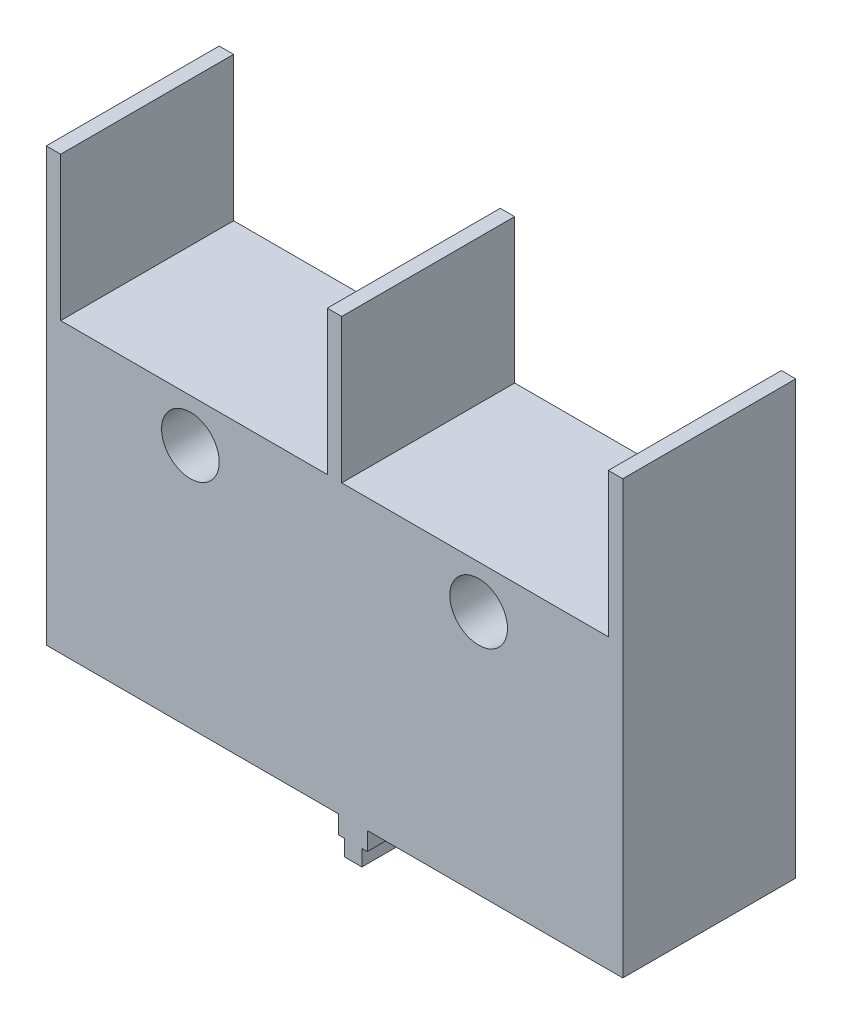
ISO-10303-21;
HEADER;
FILE_DESCRIPTION(('STEP AP214'),'2;1');
FILE_NAME('part.step','',(''),(''),'','','');
FILE_SCHEMA(('AUTOMOTIVE_DESIGN { 1 0 10303 214 1 1 1 1 }'));
ENDSEC;
DATA;
#1=APPLICATION_CONTEXT('core data for automotive mechanical design processes');
#2=APPLICATION_PROTOCOL_DEFINITION('international standard','automotive_design',2000,#1);
#3=PRODUCT_CONTEXT('',#1,'mechanical');
#4=PRODUCT('Part','Part','',(#3));
#5=PRODUCT_RELATED_PRODUCT_CATEGORY('part','',(#4));
#6=PRODUCT_DEFINITION_FORMATION('','',#4);
#7=PRODUCT_DEFINITION_CONTEXT('part definition',#1,'design');
#8=PRODUCT_DEFINITION('design','',#6,#7);
#9=PRODUCT_DEFINITION_SHAPE('','',#8);
#10=(LENGTH_UNIT() NAMED_UNIT(*) SI_UNIT(.MILLI.,.METRE.));
#11=(NAMED_UNIT(*) PLANE_ANGLE_UNIT() SI_UNIT($,.RADIAN.));
#12=(NAMED_UNIT(*) SI_UNIT($,.STERADIAN.) SOLID_ANGLE_UNIT());
#13=UNCERTAINTY_MEASURE_WITH_UNIT(LENGTH_MEASURE(1.E-05),#10,'distance_accuracy_value','');
#14=(GEOMETRIC_REPRESENTATION_CONTEXT(3) GLOBAL_UNCERTAINTY_ASSIGNED_CONTEXT((#13)) GLOBAL_UNIT_ASSIGNED_CONTEXT((#10,
#11,#12)) REPRESENTATION_CONTEXT('',''));
#15=CARTESIAN_POINT('',(0.,0.,0.));
#16=DIRECTION('',(0.,0.,1.));
#17=DIRECTION('',(1.,0.,0.));
#18=AXIS2_PLACEMENT_3D('',#15,#16,#17);
#19=CARTESIAN_POINT('',(0.,0.,6.));
#20=DIRECTION('',(0.,0.,-1.));
#21=DIRECTION('',(-1.,0.,0.));
#22=AXIS2_PLACEMENT_3D('',#19,#20,#21);
#23=PLANE('',#22);
#24=CARTESIAN_POINT('',(5.,8.5,6.));
#25=DIRECTION('',(0.,0.,1.));
#26=DIRECTION('',(1.,0.,0.));
#27=AXIS2_PLACEMENT_3D('',#24,#25,#26);
#28=CIRCLE('',#27,0.999999999999999);
#29=CARTESIAN_POINT('',(6.,8.5,6.));
#30=VERTEX_POINT('',#29);
#31=EDGE_CURVE('E208',#30,#30,#28,.T.);
#32=ORIENTED_EDGE('',*,*,#31,.F.);
#33=EDGE_LOOP('',(#32));
#34=FACE_BOUND('',#33,.T.);
#35=DIRECTION('',(0.,-1.,0.));
#36=VECTOR('',#35,1.);
#37=CARTESIAN_POINT('',(0.,0.,6.));
#38=LINE('',#37,#36);
#39=CARTESIAN_POINT('',(0.,15.,6.));
#40=VERTEX_POINT('',#39);
#41=CARTESIAN_POINT('',(0.,0.,6.));
#42=VERTEX_POINT('',#41);
#43=EDGE_CURVE('E49',#40,#42,#38,.T.);
#44=ORIENTED_EDGE('',*,*,#43,.T.);
#45=DIRECTION('',(1.,0.,0.));
#46=VECTOR('',#45,1.);
#47=CARTESIAN_POINT('',(0.,0.,6.));
#48=LINE('',#47,#46);
#49=CARTESIAN_POINT('',(10.1399803490076,0.,6.));
#50=VERTEX_POINT('',#49);
#51=EDGE_CURVE('E129',#42,#50,#48,.T.);
#52=ORIENTED_EDGE('',*,*,#51,.T.);
#53=DIRECTION('',(0.,-1.,0.));
#54=VECTOR('',#53,1.);
#55=CARTESIAN_POINT('',(10.1399803490076,0.,6.));
#56=LINE('',#55,#54);
#57=CARTESIAN_POINT('',(10.1399803490076,-0.631853680772032,6.));
#58=VERTEX_POINT('',#57);
#59=EDGE_CURVE('E294',#50,#58,#56,.T.);
#60=ORIENTED_EDGE('',*,*,#59,.T.);
#61=DIRECTION('',(1.,0.,0.));
#62=VECTOR('',#61,1.);
#63=CARTESIAN_POINT('',(10.1399803490076,-0.631853680772032,6.));
#64=LINE('',#63,#62);
#65=CARTESIAN_POINT('',(10.3501286029433,-0.631853680772032,6.));
#66=VERTEX_POINT('',#65);
#67=EDGE_CURVE('E314',#58,#66,#64,.T.);
#68=ORIENTED_EDGE('',*,*,#67,.T.);
#69=DIRECTION('',(0.,-1.,0.));
#70=VECTOR('',#69,1.);
#71=CARTESIAN_POINT('',(10.3501286029433,-0.631853680772032,6.));
#72=LINE('',#71,#70);
#73=CARTESIAN_POINT('',(10.3501286029433,-1.19034003065284,6.));
#74=VERTEX_POINT('',#73);
#75=EDGE_CURVE('E311',#66,#74,#72,.T.);
#76=ORIENTED_EDGE('',*,*,#75,.T.);
#77=DIRECTION('',(1.,0.,0.));
#78=VECTOR('',#77,1.);
#79=CARTESIAN_POINT('',(10.3501286029433,-1.19034003065284,6.));
#80=LINE('',#79,#78);
#81=CARTESIAN_POINT('',(10.9501286029433,-1.19034003065284,6.));
#82=VERTEX_POINT('',#81);
#83=EDGE_CURVE('E313',#74,#82,#80,.T.);
#84=ORIENTED_EDGE('',*,*,#83,.T.);
#85=DIRECTION('',(0.,1.,0.));
#86=VECTOR('',#85,1.);
#87=CARTESIAN_POINT('',(10.9501286029433,-1.19034003065284,6.));
#88=LINE('',#87,#86);
#89=CARTESIAN_POINT('',(10.9501286029433,-0.631853680772032,6.));
#90=VERTEX_POINT('',#89);
#91=EDGE_CURVE('E316',#82,#90,#88,.T.);
#92=ORIENTED_EDGE('',*,*,#91,.T.);
#93=DIRECTION('',(1.,0.,0.));
#94=VECTOR('',#93,1.);
#95=CARTESIAN_POINT('',(10.9501286029433,-0.631853680772032,6.));
#96=LINE('',#95,#94);
#97=CARTESIAN_POINT('',(11.13640568414,-0.631853680772032,6.));
#98=VERTEX_POINT('',#97);
#99=EDGE_CURVE('E322',#90,#98,#96,.T.);
#100=ORIENTED_EDGE('',*,*,#99,.T.);
#101=DIRECTION('',(0.,1.,0.));
#102=VECTOR('',#101,1.);
#103=CARTESIAN_POINT('',(11.13640568414,-0.631853680772032,6.));
#104=LINE('',#103,#102);
#105=CARTESIAN_POINT('',(11.13640568414,0.,6.));
#106=VERTEX_POINT('',#105);
#107=EDGE_CURVE('E324',#98,#106,#104,.T.);
#108=ORIENTED_EDGE('',*,*,#107,.T.);
#109=DIRECTION('',(1.,0.,0.));
#110=VECTOR('',#109,1.);
#111=CARTESIAN_POINT('',(11.13640568414,0.,6.));
#112=LINE('',#111,#110);
#113=CARTESIAN_POINT('',(20.,0.,6.));
#114=VERTEX_POINT('',#113);
#115=EDGE_CURVE('E326',#106,#114,#112,.T.);
#116=ORIENTED_EDGE('',*,*,#115,.T.);
#117=DIRECTION('',(0.,1.,0.));
#118=VECTOR('',#117,1.);
#119=CARTESIAN_POINT('',(20.,0.,6.));
#120=LINE('',#119,#118);
#121=CARTESIAN_POINT('',(20.,15.,6.));
#122=VERTEX_POINT('',#121);
#123=EDGE_CURVE('E328',#114,#122,#120,.T.);
#124=ORIENTED_EDGE('',*,*,#123,.T.);
#125=DIRECTION('',(-1.,0.,0.));
#126=VECTOR('',#125,1.);
#127=CARTESIAN_POINT('',(20.,15.,6.));
#128=LINE('',#127,#126);
#129=CARTESIAN_POINT('',(19.5,15.,6.));
#130=VERTEX_POINT('',#129);
#131=EDGE_CURVE('E330',#122,#130,#128,.T.);
#132=ORIENTED_EDGE('',*,*,#131,.T.);
#133=DIRECTION('',(0.,-1.,0.));
#134=VECTOR('',#133,1.);
#135=CARTESIAN_POINT('',(19.5,10.,6.));
#136=LINE('',#135,#134);
#137=CARTESIAN_POINT('',(19.5,10.,6.));
#138=VERTEX_POINT('',#137);
#139=EDGE_CURVE('E332',#130,#138,#136,.T.);
#140=ORIENTED_EDGE('',*,*,#139,.T.);
#141=DIRECTION('',(-1.,0.,0.));
#142=VECTOR('',#141,1.);
#143=CARTESIAN_POINT('',(10.25,10.,6.));
#144=LINE('',#143,#142);
#145=CARTESIAN_POINT('',(10.25,10.,6.));
#146=VERTEX_POINT('',#145);
#147=EDGE_CURVE('E334',#138,#146,#144,.T.);
#148=ORIENTED_EDGE('',*,*,#147,.T.);
#149=DIRECTION('',(0.,1.,0.));
#150=VECTOR('',#149,1.);
#151=CARTESIAN_POINT('',(10.25,10.,6.));
#152=LINE('',#151,#150);
#153=CARTESIAN_POINT('',(10.25,15.,6.));
#154=VERTEX_POINT('',#153);
#155=EDGE_CURVE('E336',#146,#154,#152,.T.);
#156=ORIENTED_EDGE('',*,*,#155,.T.);
#157=DIRECTION('',(-1.,0.,0.));
#158=VECTOR('',#157,1.);
#159=CARTESIAN_POINT('',(10.25,15.,6.));
#160=LINE('',#159,#158);
#161=CARTESIAN_POINT('',(9.75,15.,6.));
#162=VERTEX_POINT('',#161);
#163=EDGE_CURVE('E338',#154,#162,#160,.T.);
#164=ORIENTED_EDGE('',*,*,#163,.T.);
#165=DIRECTION('',(0.,-1.,0.));
#166=VECTOR('',#165,1.);
#167=CARTESIAN_POINT('',(9.75,10.,6.));
#168=LINE('',#167,#166);
#169=CARTESIAN_POINT('',(9.75,10.,6.));
#170=VERTEX_POINT('',#169);
#171=EDGE_CURVE('E185',#162,#170,#168,.T.);
#172=ORIENTED_EDGE('',*,*,#171,.T.);
#173=DIRECTION('',(-1.,0.,0.));
#174=VECTOR('',#173,1.);
#175=CARTESIAN_POINT('',(0.5,10.,6.));
#176=LINE('',#175,#174);
#177=CARTESIAN_POINT('',(0.5,10.,6.));
#178=VERTEX_POINT('',#177);
#179=EDGE_CURVE('E179',#170,#178,#176,.T.);
#180=ORIENTED_EDGE('',*,*,#179,.T.);
#181=DIRECTION('',(0.,1.,0.));
#182=VECTOR('',#181,1.);
#183=CARTESIAN_POINT('',(0.5,10.,6.));
#184=LINE('',#183,#182);
#185=CARTESIAN_POINT('',(0.5,15.,6.));
#186=VERTEX_POINT('',#185);
#187=EDGE_CURVE('E183',#178,#186,#184,.T.);
#188=ORIENTED_EDGE('',*,*,#187,.T.);
#189=DIRECTION('',(-1.,0.,0.));
#190=VECTOR('',#189,1.);
#191=CARTESIAN_POINT('',(0.,15.,6.));
#192=LINE('',#191,#190);
#193=EDGE_CURVE('E199',#186,#40,#192,.T.);
#194=ORIENTED_EDGE('',*,*,#193,.T.);
#195=EDGE_LOOP('',(#44,#52,#60,#68,#76,#84,#92,#100,#108,#116,#124,#132,#140,#148,#156,#164,
#172,#180,#188,#194));
#196=FACE_BOUND('',#195,.T.);
#197=CARTESIAN_POINT('',(15.,8.5,6.));
#198=DIRECTION('',(0.,0.,1.));
#199=DIRECTION('',(1.,0.,0.));
#200=AXIS2_PLACEMENT_3D('',#197,#198,#199);
#201=CIRCLE('',#200,1.);
#202=CARTESIAN_POINT('',(16.,8.5,6.));
#203=VERTEX_POINT('',#202);
#204=EDGE_CURVE('E357',#203,#203,#201,.T.);
#205=ORIENTED_EDGE('',*,*,#204,.F.);
#206=EDGE_LOOP('',(#205));
#207=FACE_BOUND('',#206,.T.);
#208=ADVANCED_FACE('F32',(#34,#196,#207),#23,.F.);
#209=CARTESIAN_POINT('',(0.,0.,0.));
#210=DIRECTION('',(0.,0.,-1.));
#211=DIRECTION('',(-1.,0.,0.));
#212=AXIS2_PLACEMENT_3D('',#209,#210,#211);
#213=PLANE('',#212);
#214=CARTESIAN_POINT('',(5.,8.5,0.));
#215=DIRECTION('',(0.,0.,1.));
#216=DIRECTION('',(1.,0.,0.));
#217=AXIS2_PLACEMENT_3D('',#214,#215,#216);
#218=CIRCLE('',#217,0.999999999999999);
#219=CARTESIAN_POINT('',(6.,8.5,0.));
#220=VERTEX_POINT('',#219);
#221=EDGE_CURVE('E354',#220,#220,#218,.T.);
#222=ORIENTED_EDGE('',*,*,#221,.T.);
#223=EDGE_LOOP('',(#222));
#224=FACE_BOUND('',#223,.T.);
#225=DIRECTION('',(1.,0.,0.));
#226=VECTOR('',#225,1.);
#227=CARTESIAN_POINT('',(0.,0.,0.));
#228=LINE('',#227,#226);
#229=CARTESIAN_POINT('',(0.,0.,0.));
#230=VERTEX_POINT('',#229);
#231=CARTESIAN_POINT('',(10.1399803490076,0.,0.));
#232=VERTEX_POINT('',#231);
#233=EDGE_CURVE('E205',#230,#232,#228,.T.);
#234=ORIENTED_EDGE('',*,*,#233,.F.);
#235=DIRECTION('',(0.,-1.,0.));
#236=VECTOR('',#235,1.);
#237=CARTESIAN_POINT('',(0.,10.,0.));
#238=LINE('',#237,#236);
#239=CARTESIAN_POINT('',(0.,15.,0.));
#240=VERTEX_POINT('',#239);
#241=EDGE_CURVE('E242',#240,#230,#238,.T.);
#242=ORIENTED_EDGE('',*,*,#241,.F.);
#243=DIRECTION('',(-1.,0.,0.));
#244=VECTOR('',#243,1.);
#245=CARTESIAN_POINT('',(0.,15.,0.));
#246=LINE('',#245,#244);
#247=CARTESIAN_POINT('',(0.5,15.,0.));
#248=VERTEX_POINT('',#247);
#249=EDGE_CURVE('E122',#248,#240,#246,.T.);
#250=ORIENTED_EDGE('',*,*,#249,.F.);
#251=DIRECTION('',(0.,1.,0.));
#252=VECTOR('',#251,1.);
#253=CARTESIAN_POINT('',(0.5,10.,0.));
#254=LINE('',#253,#252);
#255=CARTESIAN_POINT('',(0.5,10.,0.));
#256=VERTEX_POINT('',#255);
#257=EDGE_CURVE('E115',#256,#248,#254,.T.);
#258=ORIENTED_EDGE('',*,*,#257,.F.);
#259=DIRECTION('',(-1.,0.,0.));
#260=VECTOR('',#259,1.);
#261=CARTESIAN_POINT('',(0.5,10.,0.));
#262=LINE('',#261,#260);
#263=CARTESIAN_POINT('',(9.75,10.,0.));
#264=VERTEX_POINT('',#263);
#265=EDGE_CURVE('E193',#264,#256,#262,.T.);
#266=ORIENTED_EDGE('',*,*,#265,.F.);
#267=DIRECTION('',(0.,-1.,0.));
#268=VECTOR('',#267,1.);
#269=CARTESIAN_POINT('',(9.75,10.,0.));
#270=LINE('',#269,#268);
#271=CARTESIAN_POINT('',(9.75,15.,0.));
#272=VERTEX_POINT('',#271);
#273=EDGE_CURVE('E237',#272,#264,#270,.T.);
#274=ORIENTED_EDGE('',*,*,#273,.F.);
#275=DIRECTION('',(-1.,0.,0.));
#276=VECTOR('',#275,1.);
#277=CARTESIAN_POINT('',(10.25,15.,0.));
#278=LINE('',#277,#276);
#279=CARTESIAN_POINT('',(10.25,15.,0.));
#280=VERTEX_POINT('',#279);
#281=EDGE_CURVE('E235',#280,#272,#278,.T.);
#282=ORIENTED_EDGE('',*,*,#281,.F.);
#283=DIRECTION('',(0.,1.,0.));
#284=VECTOR('',#283,1.);
#285=CARTESIAN_POINT('',(10.25,10.,0.));
#286=LINE('',#285,#284);
#287=CARTESIAN_POINT('',(10.25,10.,0.));
#288=VERTEX_POINT('',#287);
#289=EDGE_CURVE('E233',#288,#280,#286,.T.);
#290=ORIENTED_EDGE('',*,*,#289,.F.);
#291=DIRECTION('',(-1.,0.,0.));
#292=VECTOR('',#291,1.);
#293=CARTESIAN_POINT('',(10.25,10.,0.));
#294=LINE('',#293,#292);
#295=CARTESIAN_POINT('',(19.5,10.,0.));
#296=VERTEX_POINT('',#295);
#297=EDGE_CURVE('E231',#296,#288,#294,.T.);
#298=ORIENTED_EDGE('',*,*,#297,.F.);
#299=DIRECTION('',(0.,-1.,0.));
#300=VECTOR('',#299,1.);
#301=CARTESIAN_POINT('',(19.5,10.,0.));
#302=LINE('',#301,#300);
#303=CARTESIAN_POINT('',(19.5,15.,0.));
#304=VERTEX_POINT('',#303);
#305=EDGE_CURVE('E229',#304,#296,#302,.T.);
#306=ORIENTED_EDGE('',*,*,#305,.F.);
#307=DIRECTION('',(-1.,0.,0.));
#308=VECTOR('',#307,1.);
#309=CARTESIAN_POINT('',(20.,15.,0.));
#310=LINE('',#309,#308);
#311=CARTESIAN_POINT('',(20.,15.,0.));
#312=VERTEX_POINT('',#311);
#313=EDGE_CURVE('E227',#312,#304,#310,.T.);
#314=ORIENTED_EDGE('',*,*,#313,.F.);
#315=DIRECTION('',(0.,1.,0.));
#316=VECTOR('',#315,1.);
#317=CARTESIAN_POINT('',(20.,10.,0.));
#318=LINE('',#317,#316);
#319=CARTESIAN_POINT('',(20.,0.,0.));
#320=VERTEX_POINT('',#319);
#321=EDGE_CURVE('E225',#320,#312,#318,.T.);
#322=ORIENTED_EDGE('',*,*,#321,.F.);
#323=DIRECTION('',(1.,0.,0.));
#324=VECTOR('',#323,1.);
#325=CARTESIAN_POINT('',(11.13640568414,0.,0.));
#326=LINE('',#325,#324);
#327=CARTESIAN_POINT('',(11.13640568414,0.,0.));
#328=VERTEX_POINT('',#327);
#329=EDGE_CURVE('E222',#328,#320,#326,.T.);
#330=ORIENTED_EDGE('',*,*,#329,.F.);
#331=DIRECTION('',(0.,1.,0.));
#332=VECTOR('',#331,1.);
#333=CARTESIAN_POINT('',(11.13640568414,-0.631853680772032,0.));
#334=LINE('',#333,#332);
#335=CARTESIAN_POINT('',(11.13640568414,-0.631853680772032,0.));
#336=VERTEX_POINT('',#335);
#337=EDGE_CURVE('E220',#336,#328,#334,.T.);
#338=ORIENTED_EDGE('',*,*,#337,.F.);
#339=DIRECTION('',(1.,0.,0.));
#340=VECTOR('',#339,1.);
#341=CARTESIAN_POINT('',(10.9501286029433,-0.631853680772032,0.));
#342=LINE('',#341,#340);
#343=CARTESIAN_POINT('',(10.9501286029433,-0.631853680772032,0.));
#344=VERTEX_POINT('',#343);
#345=EDGE_CURVE('E218',#344,#336,#342,.T.);
#346=ORIENTED_EDGE('',*,*,#345,.F.);
#347=DIRECTION('',(0.,1.,0.));
#348=VECTOR('',#347,1.);
#349=CARTESIAN_POINT('',(10.9501286029433,-1.19034003065284,0.));
#350=LINE('',#349,#348);
#351=CARTESIAN_POINT('',(10.9501286029433,-1.19034003065284,0.));
#352=VERTEX_POINT('',#351);
#353=EDGE_CURVE('E216',#352,#344,#350,.T.);
#354=ORIENTED_EDGE('',*,*,#353,.F.);
#355=DIRECTION('',(1.,0.,0.));
#356=VECTOR('',#355,1.);
#357=CARTESIAN_POINT('',(10.3501286029433,-1.19034003065284,0.));
#358=LINE('',#357,#356);
#359=CARTESIAN_POINT('',(10.3501286029433,-1.19034003065284,0.));
#360=VERTEX_POINT('',#359);
#361=EDGE_CURVE('E214',#360,#352,#358,.T.);
#362=ORIENTED_EDGE('',*,*,#361,.F.);
#363=DIRECTION('',(0.,-1.,0.));
#364=VECTOR('',#363,1.);
#365=CARTESIAN_POINT('',(10.3501286029433,-0.631853680772032,0.));
#366=LINE('',#365,#364);
#367=CARTESIAN_POINT('',(10.3501286029433,-0.631853680772032,0.));
#368=VERTEX_POINT('',#367);
#369=EDGE_CURVE('E212',#368,#360,#366,.T.);
#370=ORIENTED_EDGE('',*,*,#369,.F.);
#371=DIRECTION('',(1.,0.,0.));
#372=VECTOR('',#371,1.);
#373=CARTESIAN_POINT('',(10.1399803490076,-0.631853680772032,0.));
#374=LINE('',#373,#372);
#375=CARTESIAN_POINT('',(10.1399803490076,-0.631853680772032,0.));
#376=VERTEX_POINT('',#375);
#377=EDGE_CURVE('E210',#376,#368,#374,.T.);
#378=ORIENTED_EDGE('',*,*,#377,.F.);
#379=DIRECTION('',(0.,-1.,0.));
#380=VECTOR('',#379,1.);
#381=CARTESIAN_POINT('',(10.1399803490076,0.,0.));
#382=LINE('',#381,#380);
#383=EDGE_CURVE('E207',#232,#376,#382,.T.);
#384=ORIENTED_EDGE('',*,*,#383,.F.);
#385=EDGE_LOOP('',(#234,#242,#250,#258,#266,#274,#282,#290,#298,#306,#314,#322,#330,#338,#346,
#354,#362,#370,#378,#384));
#386=FACE_BOUND('',#385,.T.);
#387=CARTESIAN_POINT('',(15.,8.5,0.));
#388=DIRECTION('',(0.,0.,1.));
#389=DIRECTION('',(1.,0.,0.));
#390=AXIS2_PLACEMENT_3D('',#387,#388,#389);
#391=CIRCLE('',#390,1.);
#392=CARTESIAN_POINT('',(16.,8.5,0.));
#393=VERTEX_POINT('',#392);
#394=EDGE_CURVE('E360',#393,#393,#391,.T.);
#395=ORIENTED_EDGE('',*,*,#394,.T.);
#396=EDGE_LOOP('',(#395));
#397=FACE_BOUND('',#396,.T.);
#398=ADVANCED_FACE('F298',(#224,#386,#397),#213,.T.);
#399=CARTESIAN_POINT('',(0.,0.,6.));
#400=DIRECTION('',(0.,1.,0.));
#401=DIRECTION('',(0.,0.,1.));
#402=AXIS2_PLACEMENT_3D('',#399,#400,#401);
#403=PLANE('',#402);
#404=ORIENTED_EDGE('',*,*,#233,.T.);
#405=DIRECTION('',(0.,0.,-1.));
#406=VECTOR('',#405,1.);
#407=CARTESIAN_POINT('',(10.1399803490076,0.,6.));
#408=LINE('',#407,#406);
#409=EDGE_CURVE('E41',#50,#232,#408,.T.);
#410=ORIENTED_EDGE('',*,*,#409,.F.);
#411=ORIENTED_EDGE('',*,*,#51,.F.);
#412=DIRECTION('',(0.,0.,-1.));
#413=VECTOR('',#412,1.);
#414=CARTESIAN_POINT('',(0.,0.,6.));
#415=LINE('',#414,#413);
#416=EDGE_CURVE('E11',#42,#230,#415,.T.);
#417=ORIENTED_EDGE('',*,*,#416,.T.);
#418=EDGE_LOOP('',(#404,#410,#411,#417));
#419=FACE_BOUND('',#418,.T.);
#420=ADVANCED_FACE('F34',(#419),#403,.F.);
#421=CARTESIAN_POINT('',(10.1399803490076,0.,6.));
#422=DIRECTION('',(1.,0.,0.));
#423=DIRECTION('',(0.,0.,-1.));
#424=AXIS2_PLACEMENT_3D('',#421,#422,#423);
#425=PLANE('',#424);
#426=ORIENTED_EDGE('',*,*,#383,.T.);
#427=DIRECTION('',(0.,0.,-1.));
#428=VECTOR('',#427,1.);
#429=CARTESIAN_POINT('',(10.1399803490076,-0.631853680772032,6.));
#430=LINE('',#429,#428);
#431=EDGE_CURVE('E286',#58,#376,#430,.T.);
#432=ORIENTED_EDGE('',*,*,#431,.F.);
#433=ORIENTED_EDGE('',*,*,#59,.F.);
#434=ORIENTED_EDGE('',*,*,#409,.T.);
#435=EDGE_LOOP('',(#426,#432,#433,#434));
#436=FACE_BOUND('',#435,.T.);
#437=ADVANCED_FACE('F292',(#436),#425,.F.);
#438=CARTESIAN_POINT('',(10.1399803490076,-0.631853680772032,6.));
#439=DIRECTION('',(0.,1.,0.));
#440=DIRECTION('',(0.,0.,1.));
#441=AXIS2_PLACEMENT_3D('',#438,#439,#440);
#442=PLANE('',#441);
#443=ORIENTED_EDGE('',*,*,#377,.T.);
#444=DIRECTION('',(0.,0.,-1.));
#445=VECTOR('',#444,1.);
#446=CARTESIAN_POINT('',(10.3501286029433,-0.631853680772032,6.));
#447=LINE('',#446,#445);
#448=EDGE_CURVE('E283',#66,#368,#447,.T.);
#449=ORIENTED_EDGE('',*,*,#448,.F.);
#450=ORIENTED_EDGE('',*,*,#67,.F.);
#451=ORIENTED_EDGE('',*,*,#431,.T.);
#452=EDGE_LOOP('',(#443,#449,#450,#451));
#453=FACE_BOUND('',#452,.T.);
#454=ADVANCED_FACE('F305',(#453),#442,.F.);
#455=CARTESIAN_POINT('',(10.3501286029433,-0.631853680772032,6.));
#456=DIRECTION('',(1.,0.,0.));
#457=DIRECTION('',(0.,0.,-1.));
#458=AXIS2_PLACEMENT_3D('',#455,#456,#457);
#459=PLANE('',#458);
#460=ORIENTED_EDGE('',*,*,#369,.T.);
#461=DIRECTION('',(0.,0.,-1.));
#462=VECTOR('',#461,1.);
#463=CARTESIAN_POINT('',(10.3501286029433,-1.19034003065284,6.));
#464=LINE('',#463,#462);
#465=EDGE_CURVE('E280',#74,#360,#464,.T.);
#466=ORIENTED_EDGE('',*,*,#465,.F.);
#467=ORIENTED_EDGE('',*,*,#75,.F.);
#468=ORIENTED_EDGE('',*,*,#448,.T.);
#469=EDGE_LOOP('',(#460,#466,#467,#468));
#470=FACE_BOUND('',#469,.T.);
#471=ADVANCED_FACE('F309',(#470),#459,.F.);
#472=CARTESIAN_POINT('',(10.3501286029433,-1.19034003065284,6.));
#473=DIRECTION('',(0.,1.,0.));
#474=DIRECTION('',(0.,0.,1.));
#475=AXIS2_PLACEMENT_3D('',#472,#473,#474);
#476=PLANE('',#475);
#477=ORIENTED_EDGE('',*,*,#361,.T.);
#478=DIRECTION('',(0.,0.,-1.));
#479=VECTOR('',#478,1.);
#480=CARTESIAN_POINT('',(10.9501286029433,-1.19034003065284,6.));
#481=LINE('',#480,#479);
#482=EDGE_CURVE('E277',#82,#352,#481,.T.);
#483=ORIENTED_EDGE('',*,*,#482,.F.);
#484=ORIENTED_EDGE('',*,*,#83,.F.);
#485=ORIENTED_EDGE('',*,*,#465,.T.);
#486=EDGE_LOOP('',(#477,#483,#484,#485));
#487=FACE_BOUND('',#486,.T.);
#488=ADVANCED_FACE('F428',(#487),#476,.F.);
#489=CARTESIAN_POINT('',(10.9501286029433,-1.19034003065284,6.));
#490=DIRECTION('',(-1.,0.,0.));
#491=DIRECTION('',(0.,0.,1.));
#492=AXIS2_PLACEMENT_3D('',#489,#490,#491);
#493=PLANE('',#492);
#494=ORIENTED_EDGE('',*,*,#353,.T.);
#495=DIRECTION('',(0.,0.,-1.));
#496=VECTOR('',#495,1.);
#497=CARTESIAN_POINT('',(10.9501286029433,-0.631853680772032,6.));
#498=LINE('',#497,#496);
#499=EDGE_CURVE('E274',#90,#344,#498,.T.);
#500=ORIENTED_EDGE('',*,*,#499,.F.);
#501=ORIENTED_EDGE('',*,*,#91,.F.);
#502=ORIENTED_EDGE('',*,*,#482,.T.);
#503=EDGE_LOOP('',(#494,#500,#501,#502));
#504=FACE_BOUND('',#503,.T.);
#505=ADVANCED_FACE('F424',(#504),#493,.F.);
#506=CARTESIAN_POINT('',(10.9501286029433,-0.631853680772032,6.));
#507=DIRECTION('',(0.,1.,0.));
#508=DIRECTION('',(0.,0.,1.));
#509=AXIS2_PLACEMENT_3D('',#506,#507,#508);
#510=PLANE('',#509);
#511=ORIENTED_EDGE('',*,*,#345,.T.);
#512=DIRECTION('',(0.,0.,-1.));
#513=VECTOR('',#512,1.);
#514=CARTESIAN_POINT('',(11.13640568414,-0.631853680772032,6.));
#515=LINE('',#514,#513);
#516=EDGE_CURVE('E271',#98,#336,#515,.T.);
#517=ORIENTED_EDGE('',*,*,#516,.F.);
#518=ORIENTED_EDGE('',*,*,#99,.F.);
#519=ORIENTED_EDGE('',*,*,#499,.T.);
#520=EDGE_LOOP('',(#511,#517,#518,#519));
#521=FACE_BOUND('',#520,.T.);
#522=ADVANCED_FACE('F420',(#521),#510,.F.);
#523=CARTESIAN_POINT('',(11.13640568414,-0.631853680772032,6.));
#524=DIRECTION('',(-1.,0.,0.));
#525=DIRECTION('',(0.,0.,1.));
#526=AXIS2_PLACEMENT_3D('',#523,#524,#525);
#527=PLANE('',#526);
#528=ORIENTED_EDGE('',*,*,#337,.T.);
#529=DIRECTION('',(0.,0.,-1.));
#530=VECTOR('',#529,1.);
#531=CARTESIAN_POINT('',(11.13640568414,0.,6.));
#532=LINE('',#531,#530);
#533=EDGE_CURVE('E268',#106,#328,#532,.T.);
#534=ORIENTED_EDGE('',*,*,#533,.F.);
#535=ORIENTED_EDGE('',*,*,#107,.F.);
#536=ORIENTED_EDGE('',*,*,#516,.T.);
#537=EDGE_LOOP('',(#528,#534,#535,#536));
#538=FACE_BOUND('',#537,.T.);
#539=ADVANCED_FACE('F416',(#538),#527,.F.);
#540=CARTESIAN_POINT('',(11.13640568414,0.,6.));
#541=DIRECTION('',(0.,1.,0.));
#542=DIRECTION('',(0.,0.,1.));
#543=AXIS2_PLACEMENT_3D('',#540,#541,#542);
#544=PLANE('',#543);
#545=ORIENTED_EDGE('',*,*,#329,.T.);
#546=DIRECTION('',(0.,0.,-1.));
#547=VECTOR('',#546,1.);
#548=CARTESIAN_POINT('',(20.,0.,6.));
#549=LINE('',#548,#547);
#550=EDGE_CURVE('E265',#114,#320,#549,.T.);
#551=ORIENTED_EDGE('',*,*,#550,.F.);
#552=ORIENTED_EDGE('',*,*,#115,.F.);
#553=ORIENTED_EDGE('',*,*,#533,.T.);
#554=EDGE_LOOP('',(#545,#551,#552,#553));
#555=FACE_BOUND('',#554,.T.);
#556=ADVANCED_FACE('F412',(#555),#544,.F.);
#557=CARTESIAN_POINT('',(20.,10.,6.));
#558=DIRECTION('',(-1.,0.,0.));
#559=DIRECTION('',(0.,0.,1.));
#560=AXIS2_PLACEMENT_3D('',#557,#558,#559);
#561=PLANE('',#560);
#562=ORIENTED_EDGE('',*,*,#321,.T.);
#563=DIRECTION('',(0.,0.,-1.));
#564=VECTOR('',#563,1.);
#565=CARTESIAN_POINT('',(20.,15.,6.));
#566=LINE('',#565,#564);
#567=EDGE_CURVE('E262',#122,#312,#566,.T.);
#568=ORIENTED_EDGE('',*,*,#567,.F.);
#569=ORIENTED_EDGE('',*,*,#123,.F.);
#570=ORIENTED_EDGE('',*,*,#550,.T.);
#571=EDGE_LOOP('',(#562,#568,#569,#570));
#572=FACE_BOUND('',#571,.T.);
#573=ADVANCED_FACE('F408',(#572),#561,.F.);
#574=CARTESIAN_POINT('',(20.,15.,6.));
#575=DIRECTION('',(0.,-1.,0.));
#576=DIRECTION('',(0.,0.,-1.));
#577=AXIS2_PLACEMENT_3D('',#574,#575,#576);
#578=PLANE('',#577);
#579=ORIENTED_EDGE('',*,*,#313,.T.);
#580=DIRECTION('',(0.,0.,-1.));
#581=VECTOR('',#580,1.);
#582=CARTESIAN_POINT('',(19.5,15.,6.));
#583=LINE('',#582,#581);
#584=EDGE_CURVE('E259',#130,#304,#583,.T.);
#585=ORIENTED_EDGE('',*,*,#584,.F.);
#586=ORIENTED_EDGE('',*,*,#131,.F.);
#587=ORIENTED_EDGE('',*,*,#567,.T.);
#588=EDGE_LOOP('',(#579,#585,#586,#587));
#589=FACE_BOUND('',#588,.T.);
#590=ADVANCED_FACE('F404',(#589),#578,.F.);
#591=CARTESIAN_POINT('',(19.5,10.,6.));
#592=DIRECTION('',(1.,0.,0.));
#593=DIRECTION('',(0.,0.,-1.));
#594=AXIS2_PLACEMENT_3D('',#591,#592,#593);
#595=PLANE('',#594);
#596=ORIENTED_EDGE('',*,*,#305,.T.);
#597=DIRECTION('',(0.,0.,-1.));
#598=VECTOR('',#597,1.);
#599=CARTESIAN_POINT('',(19.5,10.,6.));
#600=LINE('',#599,#598);
#601=EDGE_CURVE('E256',#138,#296,#600,.T.);
#602=ORIENTED_EDGE('',*,*,#601,.F.);
#603=ORIENTED_EDGE('',*,*,#139,.F.);
#604=ORIENTED_EDGE('',*,*,#584,.T.);
#605=EDGE_LOOP('',(#596,#602,#603,#604));
#606=FACE_BOUND('',#605,.T.);
#607=ADVANCED_FACE('F400',(#606),#595,.F.);
#608=CARTESIAN_POINT('',(10.25,10.,6.));
#609=DIRECTION('',(0.,-1.,0.));
#610=DIRECTION('',(0.,0.,-1.));
#611=AXIS2_PLACEMENT_3D('',#608,#609,#610);
#612=PLANE('',#611);
#613=ORIENTED_EDGE('',*,*,#297,.T.);
#614=DIRECTION('',(0.,0.,-1.));
#615=VECTOR('',#614,1.);
#616=CARTESIAN_POINT('',(10.25,10.,6.));
#617=LINE('',#616,#615);
#618=EDGE_CURVE('E253',#146,#288,#617,.T.);
#619=ORIENTED_EDGE('',*,*,#618,.F.);
#620=ORIENTED_EDGE('',*,*,#147,.F.);
#621=ORIENTED_EDGE('',*,*,#601,.T.);
#622=EDGE_LOOP('',(#613,#619,#620,#621));
#623=FACE_BOUND('',#622,.T.);
#624=ADVANCED_FACE('F396',(#623),#612,.F.);
#625=CARTESIAN_POINT('',(10.25,10.,6.));
#626=DIRECTION('',(-1.,0.,0.));
#627=DIRECTION('',(0.,0.,1.));
#628=AXIS2_PLACEMENT_3D('',#625,#626,#627);
#629=PLANE('',#628);
#630=ORIENTED_EDGE('',*,*,#289,.T.);
#631=DIRECTION('',(0.,0.,-1.));
#632=VECTOR('',#631,1.);
#633=CARTESIAN_POINT('',(10.25,15.,6.));
#634=LINE('',#633,#632);
#635=EDGE_CURVE('E250',#154,#280,#634,.T.);
#636=ORIENTED_EDGE('',*,*,#635,.F.);
#637=ORIENTED_EDGE('',*,*,#155,.F.);
#638=ORIENTED_EDGE('',*,*,#618,.T.);
#639=EDGE_LOOP('',(#630,#636,#637,#638));
#640=FACE_BOUND('',#639,.T.);
#641=ADVANCED_FACE('F393',(#640),#629,.F.);
#642=CARTESIAN_POINT('',(10.25,15.,6.));
#643=DIRECTION('',(0.,-1.,0.));
#644=DIRECTION('',(0.,0.,-1.));
#645=AXIS2_PLACEMENT_3D('',#642,#643,#644);
#646=PLANE('',#645);
#647=ORIENTED_EDGE('',*,*,#281,.T.);
#648=DIRECTION('',(0.,0.,-1.));
#649=VECTOR('',#648,1.);
#650=CARTESIAN_POINT('',(9.75,15.,6.));
#651=LINE('',#650,#649);
#652=EDGE_CURVE('E247',#162,#272,#651,.T.);
#653=ORIENTED_EDGE('',*,*,#652,.F.);
#654=ORIENTED_EDGE('',*,*,#163,.F.);
#655=ORIENTED_EDGE('',*,*,#635,.T.);
#656=EDGE_LOOP('',(#647,#653,#654,#655));
#657=FACE_BOUND('',#656,.T.);
#658=ADVANCED_FACE('F344',(#657),#646,.F.);
#659=CARTESIAN_POINT('',(9.75,10.,6.));
#660=DIRECTION('',(1.,0.,0.));
#661=DIRECTION('',(0.,0.,-1.));
#662=AXIS2_PLACEMENT_3D('',#659,#660,#661);
#663=PLANE('',#662);
#664=ORIENTED_EDGE('',*,*,#273,.T.);
#665=DIRECTION('',(0.,0.,-1.));
#666=VECTOR('',#665,1.);
#667=CARTESIAN_POINT('',(9.75,10.,6.));
#668=LINE('',#667,#666);
#669=EDGE_CURVE('E194',#170,#264,#668,.T.);
#670=ORIENTED_EDGE('',*,*,#669,.F.);
#671=ORIENTED_EDGE('',*,*,#171,.F.);
#672=ORIENTED_EDGE('',*,*,#652,.T.);
#673=EDGE_LOOP('',(#664,#670,#671,#672));
#674=FACE_BOUND('',#673,.T.);
#675=ADVANCED_FACE('F348',(#674),#663,.F.);
#676=CARTESIAN_POINT('',(0.5,10.,6.));
#677=DIRECTION('',(0.,-1.,0.));
#678=DIRECTION('',(0.,0.,-1.));
#679=AXIS2_PLACEMENT_3D('',#676,#677,#678);
#680=PLANE('',#679);
#681=ORIENTED_EDGE('',*,*,#265,.T.);
#682=DIRECTION('',(0.,0.,-1.));
#683=VECTOR('',#682,1.);
#684=CARTESIAN_POINT('',(0.5,10.,6.));
#685=LINE('',#684,#683);
#686=EDGE_CURVE('E190',#178,#256,#685,.T.);
#687=ORIENTED_EDGE('',*,*,#686,.F.);
#688=ORIENTED_EDGE('',*,*,#179,.F.);
#689=ORIENTED_EDGE('',*,*,#669,.T.);
#690=EDGE_LOOP('',(#681,#687,#688,#689));
#691=FACE_BOUND('',#690,.T.);
#692=ADVANCED_FACE('F191',(#691),#680,.F.);
#693=CARTESIAN_POINT('',(0.5,10.,6.));
#694=DIRECTION('',(-1.,0.,0.));
#695=DIRECTION('',(0.,0.,1.));
#696=AXIS2_PLACEMENT_3D('',#693,#694,#695);
#697=PLANE('',#696);
#698=ORIENTED_EDGE('',*,*,#257,.T.);
#699=DIRECTION('',(0.,0.,-1.));
#700=VECTOR('',#699,1.);
#701=CARTESIAN_POINT('',(0.5,15.,6.));
#702=LINE('',#701,#700);
#703=EDGE_CURVE('E195',#186,#248,#702,.T.);
#704=ORIENTED_EDGE('',*,*,#703,.F.);
#705=ORIENTED_EDGE('',*,*,#187,.F.);
#706=ORIENTED_EDGE('',*,*,#686,.T.);
#707=EDGE_LOOP('',(#698,#704,#705,#706));
#708=FACE_BOUND('',#707,.T.);
#709=ADVANCED_FACE('F197',(#708),#697,.F.);
#710=CARTESIAN_POINT('',(0.,15.,6.));
#711=DIRECTION('',(0.,-1.,0.));
#712=DIRECTION('',(0.,0.,-1.));
#713=AXIS2_PLACEMENT_3D('',#710,#711,#712);
#714=PLANE('',#713);
#715=ORIENTED_EDGE('',*,*,#249,.T.);
#716=DIRECTION('',(0.,0.,-1.));
#717=VECTOR('',#716,1.);
#718=CARTESIAN_POINT('',(0.,15.,6.));
#719=LINE('',#718,#717);
#720=EDGE_CURVE('E201',#40,#240,#719,.T.);
#721=ORIENTED_EDGE('',*,*,#720,.F.);
#722=ORIENTED_EDGE('',*,*,#193,.F.);
#723=ORIENTED_EDGE('',*,*,#703,.T.);
#724=EDGE_LOOP('',(#715,#721,#722,#723));
#725=FACE_BOUND('',#724,.T.);
#726=ADVANCED_FACE('F350',(#725),#714,.F.);
#727=CARTESIAN_POINT('',(0.,10.,6.));
#728=DIRECTION('',(1.,0.,0.));
#729=DIRECTION('',(0.,0.,-1.));
#730=AXIS2_PLACEMENT_3D('',#727,#728,#729);
#731=PLANE('',#730);
#732=ORIENTED_EDGE('',*,*,#241,.T.);
#733=ORIENTED_EDGE('',*,*,#416,.F.);
#734=ORIENTED_EDGE('',*,*,#43,.F.);
#735=ORIENTED_EDGE('',*,*,#720,.T.);
#736=EDGE_LOOP('',(#732,#733,#734,#735));
#737=FACE_BOUND('',#736,.T.);
#738=ADVANCED_FACE('F349',(#737),#731,.F.);
#739=CARTESIAN_POINT('',(5.,8.5,6.));
#740=DIRECTION('',(0.,0.,-1.));
#741=DIRECTION('',(-1.,0.,0.));
#742=AXIS2_PLACEMENT_3D('',#739,#740,#741);
#743=CYLINDRICAL_SURFACE('',#742,0.999999999999999);
#744=ORIENTED_EDGE('',*,*,#31,.T.);
#745=EDGE_LOOP('',(#744));
#746=FACE_BOUND('',#745,.T.);
#747=ORIENTED_EDGE('',*,*,#221,.F.);
#748=EDGE_LOOP('',(#747));
#749=FACE_BOUND('',#748,.T.);
#750=ADVANCED_FACE('F378',(#746,#749),#743,.F.);
#751=CARTESIAN_POINT('',(15.,8.5,6.));
#752=DIRECTION('',(0.,0.,-1.));
#753=DIRECTION('',(-1.,0.,0.));
#754=AXIS2_PLACEMENT_3D('',#751,#752,#753);
#755=CYLINDRICAL_SURFACE('',#754,1.);
#756=ORIENTED_EDGE('',*,*,#204,.T.);
#757=EDGE_LOOP('',(#756));
#758=FACE_BOUND('',#757,.T.);
#759=ORIENTED_EDGE('',*,*,#394,.F.);
#760=EDGE_LOOP('',(#759));
#761=FACE_BOUND('',#760,.T.);
#762=ADVANCED_FACE('F366',(#758,#761),#755,.F.);
#763=CLOSED_SHELL('',(#208,#398,#420,#437,#454,#471,#488,#505,#522,#539,#556,#573,#590,#607,
#624,#641,#658,#675,#692,#709,#726,#738,#750,#762));
#764=MANIFOLD_SOLID_BREP('B2',#763);
#765=ADVANCED_BREP_SHAPE_REPRESENTATION('',(#18,#764),#14);
#766=SHAPE_DEFINITION_REPRESENTATION(#9,#765);
ENDSEC;
END-ISO-10303-21;
